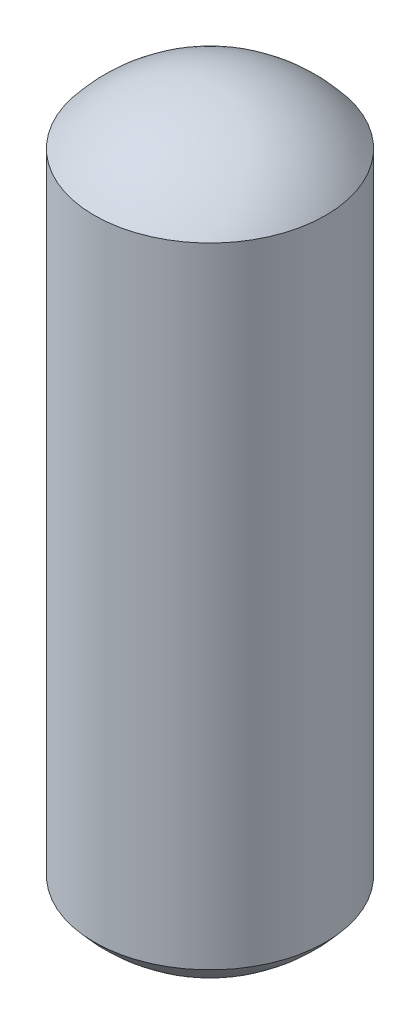
ISO-10303-21;
HEADER;
FILE_DESCRIPTION(('STEP AP214'),'2;1');
FILE_NAME('part.step','',(''),(''),'','','');
FILE_SCHEMA(('AUTOMOTIVE_DESIGN { 1 0 10303 214 1 1 1 1 }'));
ENDSEC;
DATA;
#1=APPLICATION_CONTEXT('core data for automotive mechanical design processes');
#2=APPLICATION_PROTOCOL_DEFINITION('international standard','automotive_design',2000,#1);
#3=PRODUCT_CONTEXT('',#1,'mechanical');
#4=PRODUCT('Part','Part','',(#3));
#5=PRODUCT_RELATED_PRODUCT_CATEGORY('part','',(#4));
#6=PRODUCT_DEFINITION_FORMATION('','',#4);
#7=PRODUCT_DEFINITION_CONTEXT('part definition',#1,'design');
#8=PRODUCT_DEFINITION('design','',#6,#7);
#9=PRODUCT_DEFINITION_SHAPE('','',#8);
#10=(LENGTH_UNIT() NAMED_UNIT(*) SI_UNIT(.MILLI.,.METRE.));
#11=(NAMED_UNIT(*) PLANE_ANGLE_UNIT() SI_UNIT($,.RADIAN.));
#12=(NAMED_UNIT(*) SI_UNIT($,.STERADIAN.) SOLID_ANGLE_UNIT());
#13=UNCERTAINTY_MEASURE_WITH_UNIT(LENGTH_MEASURE(1.E-05),#10,'distance_accuracy_value','');
#14=(GEOMETRIC_REPRESENTATION_CONTEXT(3) GLOBAL_UNCERTAINTY_ASSIGNED_CONTEXT((#13)) GLOBAL_UNIT_ASSIGNED_CONTEXT((#10,
#11,#12)) REPRESENTATION_CONTEXT('',''));
#15=CARTESIAN_POINT('',(0.,0.,0.));
#16=DIRECTION('',(0.,0.,1.));
#17=DIRECTION('',(1.,0.,0.));
#18=AXIS2_PLACEMENT_3D('',#15,#16,#17);
#19=CARTESIAN_POINT('',(0.,-3.20416666666666,0.));
#20=DIRECTION('',(0.,1.,0.));
#21=DIRECTION('',(1.,0.,0.));
#22=AXIS2_PLACEMENT_3D('',#19,#20,#21);
#23=SPHERICAL_SURFACE('',#22,3.20416666666666);
#24=CARTESIAN_POINT('',(0.,-1.2,0.));
#25=DIRECTION('',(0.,1.,0.));
#26=DIRECTION('',(-1.,0.,0.));
#27=AXIS2_PLACEMENT_3D('',#24,#25,#26);
#28=CIRCLE('',#27,2.5);
#29=CARTESIAN_POINT('',(-2.5,-1.2,0.));
#30=VERTEX_POINT('',#29);
#31=EDGE_CURVE('E10',#30,#30,#28,.T.);
#32=ORIENTED_EDGE('',*,*,#31,.T.);
#33=EDGE_LOOP('',(#32));
#34=FACE_BOUND('',#33,.T.);
#35=ADVANCED_FACE('F37',(#34),#23,.T.);
#36=CARTESIAN_POINT('',(0.,5.,0.));
#37=DIRECTION('',(0.,1.,0.));
#38=DIRECTION('',(-1.,0.,0.));
#39=AXIS2_PLACEMENT_3D('',#36,#37,#38);
#40=CYLINDRICAL_SURFACE('',#39,2.5);
#41=ORIENTED_EDGE('',*,*,#31,.F.);
#42=EDGE_LOOP('',(#41));
#43=FACE_BOUND('',#42,.T.);
#44=CARTESIAN_POINT('',(0.,-14.8,0.));
#45=DIRECTION('',(0.,1.,0.));
#46=DIRECTION('',(-1.,0.,0.));
#47=AXIS2_PLACEMENT_3D('',#44,#45,#46);
#48=CIRCLE('',#47,2.5);
#49=CARTESIAN_POINT('',(-2.5,-14.8,0.));
#50=VERTEX_POINT('',#49);
#51=EDGE_CURVE('E43',#50,#50,#48,.T.);
#52=ORIENTED_EDGE('',*,*,#51,.T.);
#53=EDGE_LOOP('',(#52));
#54=FACE_BOUND('',#53,.T.);
#55=ADVANCED_FACE('F49',(#43,#54),#40,.T.);
#56=CARTESIAN_POINT('',(0.,-12.7958333333333,0.));
#57=DIRECTION('',(0.,1.,0.));
#58=DIRECTION('',(-1.,0.,0.));
#59=AXIS2_PLACEMENT_3D('',#56,#57,#58);
#60=SPHERICAL_SURFACE('',#59,3.20416666666666);
#61=ORIENTED_EDGE('',*,*,#51,.F.);
#62=EDGE_LOOP('',(#61));
#63=FACE_BOUND('',#62,.T.);
#64=ADVANCED_FACE('F51',(#63),#60,.T.);
#65=CLOSED_SHELL('',(#35,#55,#64));
#66=MANIFOLD_SOLID_BREP('B2',#65);
#67=ADVANCED_BREP_SHAPE_REPRESENTATION('',(#18,#66),#14);
#68=SHAPE_DEFINITION_REPRESENTATION(#9,#67);
ENDSEC;
END-ISO-10303-21;
